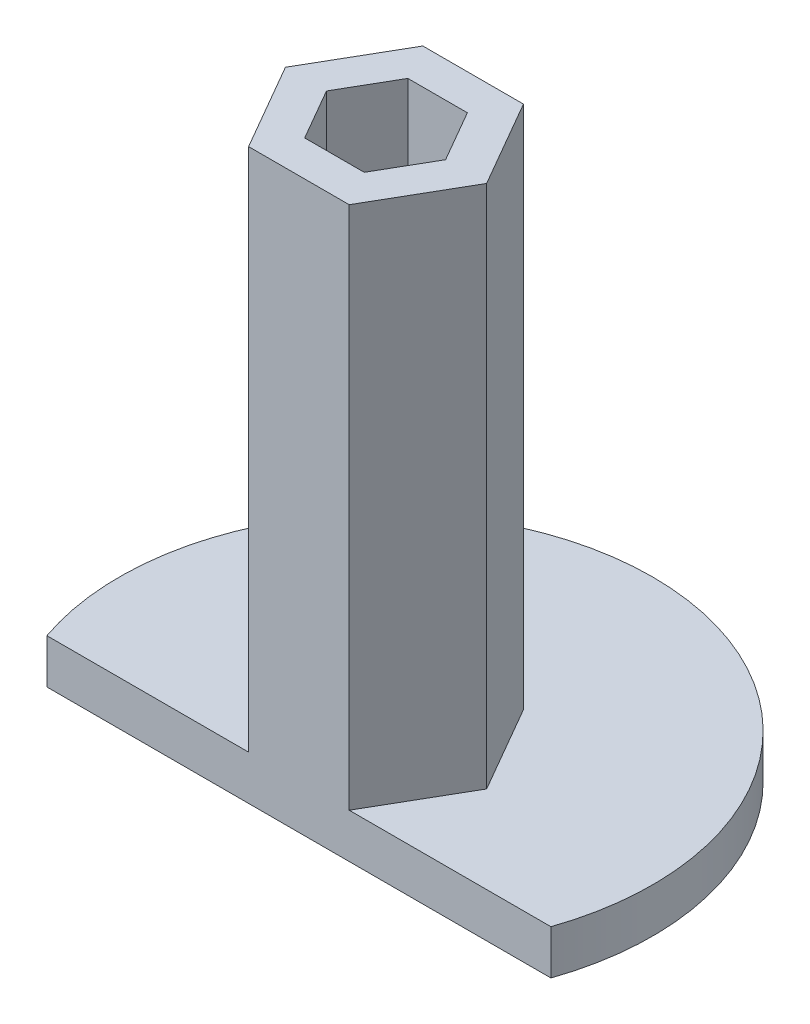
ISO-10303-21;
HEADER;
FILE_DESCRIPTION(('STEP AP214'),'2;1');
FILE_NAME('part.step','',(''),(''),'','','');
FILE_SCHEMA(('AUTOMOTIVE_DESIGN { 1 0 10303 214 1 1 1 1 }'));
ENDSEC;
DATA;
#1=APPLICATION_CONTEXT('core data for automotive mechanical design processes');
#2=APPLICATION_PROTOCOL_DEFINITION('international standard','automotive_design',2000,#1);
#3=PRODUCT_CONTEXT('',#1,'mechanical');
#4=PRODUCT('Part','Part','',(#3));
#5=PRODUCT_RELATED_PRODUCT_CATEGORY('part','',(#4));
#6=PRODUCT_DEFINITION_FORMATION('','',#4);
#7=PRODUCT_DEFINITION_CONTEXT('part definition',#1,'design');
#8=PRODUCT_DEFINITION('design','',#6,#7);
#9=PRODUCT_DEFINITION_SHAPE('','',#8);
#10=(LENGTH_UNIT() NAMED_UNIT(*) SI_UNIT(.MILLI.,.METRE.));
#11=(NAMED_UNIT(*) PLANE_ANGLE_UNIT() SI_UNIT($,.RADIAN.));
#12=(NAMED_UNIT(*) SI_UNIT($,.STERADIAN.) SOLID_ANGLE_UNIT());
#13=UNCERTAINTY_MEASURE_WITH_UNIT(LENGTH_MEASURE(1.E-05),#10,'distance_accuracy_value','');
#14=(GEOMETRIC_REPRESENTATION_CONTEXT(3) GLOBAL_UNCERTAINTY_ASSIGNED_CONTEXT((#13)) GLOBAL_UNIT_ASSIGNED_CONTEXT((#10,
#11,#12)) REPRESENTATION_CONTEXT('',''));
#15=CARTESIAN_POINT('',(0.,0.,0.));
#16=DIRECTION('',(0.,0.,1.));
#17=DIRECTION('',(1.,0.,0.));
#18=AXIS2_PLACEMENT_3D('',#15,#16,#17);
#19=CARTESIAN_POINT('',(0.,12.,0.));
#20=DIRECTION('',(0.,1.,0.));
#21=DIRECTION('',(0.,0.,1.));
#22=AXIS2_PLACEMENT_3D('',#19,#20,#21);
#23=PLANE('',#22);
#24=DIRECTION('',(-1.,0.,0.));
#25=VECTOR('',#24,1.);
#26=CARTESIAN_POINT('',(2.82970053837925,12.,-4.90118510267787));
#27=LINE('',#26,#25);
#28=CARTESIAN_POINT('',(2.82970053837925,12.,-4.90118510267787));
#29=VERTEX_POINT('',#28);
#30=CARTESIAN_POINT('',(-2.82970053837925,12.,-4.90118510267787));
#31=VERTEX_POINT('',#30);
#32=EDGE_CURVE('E215',#29,#31,#27,.T.);
#33=ORIENTED_EDGE('',*,*,#32,.T.);
#34=DIRECTION('',(-0.5,0.,0.866025403784439));
#35=VECTOR('',#34,1.);
#36=CARTESIAN_POINT('',(-2.82970053837925,12.,-4.90118510267787));
#37=LINE('',#36,#35);
#38=CARTESIAN_POINT('',(-5.6594010767585,12.,0.));
#39=VERTEX_POINT('',#38);
#40=EDGE_CURVE('E217',#31,#39,#37,.T.);
#41=ORIENTED_EDGE('',*,*,#40,.T.);
#42=DIRECTION('',(0.5,0.,0.866025403784439));
#43=VECTOR('',#42,1.);
#44=CARTESIAN_POINT('',(-5.6594010767585,12.,0.));
#45=LINE('',#44,#43);
#46=CARTESIAN_POINT('',(-2.82970053837925,12.,4.90118510267787));
#47=VERTEX_POINT('',#46);
#48=EDGE_CURVE('E219',#39,#47,#45,.T.);
#49=ORIENTED_EDGE('',*,*,#48,.T.);
#50=DIRECTION('',(1.,0.,0.));
#51=VECTOR('',#50,1.);
#52=CARTESIAN_POINT('',(-2.82970053837925,12.,4.90118510267787));
#53=LINE('',#52,#51);
#54=CARTESIAN_POINT('',(2.82970053837925,12.,4.90118510267787));
#55=VERTEX_POINT('',#54);
#56=EDGE_CURVE('E221',#47,#55,#53,.T.);
#57=ORIENTED_EDGE('',*,*,#56,.T.);
#58=DIRECTION('',(0.5,0.,-0.866025403784439));
#59=VECTOR('',#58,1.);
#60=CARTESIAN_POINT('',(2.82970053837925,12.,4.90118510267787));
#61=LINE('',#60,#59);
#62=CARTESIAN_POINT('',(5.6594010767585,12.,0.));
#63=VERTEX_POINT('',#62);
#64=EDGE_CURVE('E223',#55,#63,#61,.T.);
#65=ORIENTED_EDGE('',*,*,#64,.T.);
#66=DIRECTION('',(-0.5,0.,-0.866025403784438));
#67=VECTOR('',#66,1.);
#68=CARTESIAN_POINT('',(5.6594010767585,12.,0.));
#69=LINE('',#68,#67);
#70=EDGE_CURVE('E56',#63,#29,#69,.T.);
#71=ORIENTED_EDGE('',*,*,#70,.T.);
#72=EDGE_LOOP('',(#33,#41,#49,#57,#65,#71));
#73=FACE_BOUND('',#72,.T.);
#74=DIRECTION('',(-0.499999999999999,0.,0.866025403784439));
#75=VECTOR('',#74,1.);
#76=CARTESIAN_POINT('',(-1.675,12.,-2.90118510267787));
#77=LINE('',#76,#75);
#78=CARTESIAN_POINT('',(-1.675,12.,-2.90118510267787));
#79=VERTEX_POINT('',#78);
#80=CARTESIAN_POINT('',(-3.35,12.,0.));
#81=VERTEX_POINT('',#80);
#82=EDGE_CURVE('E176',#79,#81,#77,.T.);
#83=ORIENTED_EDGE('',*,*,#82,.F.);
#84=DIRECTION('',(-1.,0.,0.));
#85=VECTOR('',#84,1.);
#86=CARTESIAN_POINT('',(1.675,12.,-2.90118510267787));
#87=LINE('',#86,#85);
#88=CARTESIAN_POINT('',(1.675,12.,-2.90118510267787));
#89=VERTEX_POINT('',#88);
#90=EDGE_CURVE('E174',#89,#79,#87,.T.);
#91=ORIENTED_EDGE('',*,*,#90,.F.);
#92=DIRECTION('',(-0.5,0.,-0.866025403784438));
#93=VECTOR('',#92,1.);
#94=CARTESIAN_POINT('',(3.35,12.,0.));
#95=LINE('',#94,#93);
#96=CARTESIAN_POINT('',(3.35,12.,0.));
#97=VERTEX_POINT('',#96);
#98=EDGE_CURVE('E185',#97,#89,#95,.T.);
#99=ORIENTED_EDGE('',*,*,#98,.F.);
#100=DIRECTION('',(0.5,0.,-0.866025403784439));
#101=VECTOR('',#100,1.);
#102=CARTESIAN_POINT('',(1.675,12.,2.90118510267787));
#103=LINE('',#102,#101);
#104=CARTESIAN_POINT('',(1.675,12.,2.90118510267787));
#105=VERTEX_POINT('',#104);
#106=EDGE_CURVE('E183',#105,#97,#103,.T.);
#107=ORIENTED_EDGE('',*,*,#106,.F.);
#108=DIRECTION('',(1.,0.,0.));
#109=VECTOR('',#108,1.);
#110=CARTESIAN_POINT('',(-1.675,12.,2.90118510267787));
#111=LINE('',#110,#109);
#112=CARTESIAN_POINT('',(-1.675,12.,2.90118510267787));
#113=VERTEX_POINT('',#112);
#114=EDGE_CURVE('E181',#113,#105,#111,.T.);
#115=ORIENTED_EDGE('',*,*,#114,.F.);
#116=DIRECTION('',(0.5,0.,0.866025403784439));
#117=VECTOR('',#116,1.);
#118=CARTESIAN_POINT('',(-3.35,12.,0.));
#119=LINE('',#118,#117);
#120=EDGE_CURVE('E179',#81,#113,#119,.T.);
#121=ORIENTED_EDGE('',*,*,#120,.F.);
#122=EDGE_LOOP('',(#83,#91,#99,#107,#115,#121));
#123=FACE_BOUND('',#122,.T.);
#124=ADVANCED_FACE('F33',(#73,#123),#23,.T.);
#125=CARTESIAN_POINT('',(2.82970053837925,12.,-4.90118510267787));
#126=DIRECTION('',(0.,0.,1.));
#127=DIRECTION('',(1.,0.,0.));
#128=AXIS2_PLACEMENT_3D('',#125,#126,#127);
#129=PLANE('',#128);
#130=DIRECTION('',(0.,-1.,0.));
#131=VECTOR('',#130,1.);
#132=CARTESIAN_POINT('',(2.82970053837925,12.,-4.90118510267787));
#133=LINE('',#132,#131);
#134=CARTESIAN_POINT('',(2.82970053837925,-17.5,-4.90118510267787));
#135=VERTEX_POINT('',#134);
#136=EDGE_CURVE('E226',#29,#135,#133,.T.);
#137=ORIENTED_EDGE('',*,*,#136,.T.);
#138=DIRECTION('',(1.,0.,0.));
#139=VECTOR('',#138,1.);
#140=CARTESIAN_POINT('',(-2.82970053837925,-17.5,-4.90118510267787));
#141=LINE('',#140,#139);
#142=CARTESIAN_POINT('',(-2.82970053837925,-17.5,-4.90118510267787));
#143=VERTEX_POINT('',#142);
#144=EDGE_CURVE('E157',#143,#135,#141,.T.);
#145=ORIENTED_EDGE('',*,*,#144,.F.);
#146=DIRECTION('',(0.,-1.,0.));
#147=VECTOR('',#146,1.);
#148=CARTESIAN_POINT('',(-2.82970053837925,12.,-4.90118510267787));
#149=LINE('',#148,#147);
#150=EDGE_CURVE('E11',#31,#143,#149,.T.);
#151=ORIENTED_EDGE('',*,*,#150,.F.);
#152=ORIENTED_EDGE('',*,*,#32,.F.);
#153=EDGE_LOOP('',(#137,#145,#151,#152));
#154=FACE_BOUND('',#153,.T.);
#155=ADVANCED_FACE('F35',(#154),#129,.F.);
#156=CARTESIAN_POINT('',(-2.82970053837925,12.,-4.90118510267787));
#157=DIRECTION('',(0.866025403784439,0.,0.5));
#158=DIRECTION('',(0.5,0.,-0.866025403784439));
#159=AXIS2_PLACEMENT_3D('',#156,#157,#158);
#160=PLANE('',#159);
#161=ORIENTED_EDGE('',*,*,#150,.T.);
#162=DIRECTION('',(0.5,0.,-0.866025403784439));
#163=VECTOR('',#162,1.);
#164=CARTESIAN_POINT('',(-5.6594010767585,-17.5,0.));
#165=LINE('',#164,#163);
#166=CARTESIAN_POINT('',(-5.6594010767585,-17.5,0.));
#167=VERTEX_POINT('',#166);
#168=EDGE_CURVE('E154',#167,#143,#165,.T.);
#169=ORIENTED_EDGE('',*,*,#168,.F.);
#170=DIRECTION('',(0.,-1.,0.));
#171=VECTOR('',#170,1.);
#172=CARTESIAN_POINT('',(-5.6594010767585,12.,0.));
#173=LINE('',#172,#171);
#174=EDGE_CURVE('E41',#39,#167,#173,.T.);
#175=ORIENTED_EDGE('',*,*,#174,.F.);
#176=ORIENTED_EDGE('',*,*,#40,.F.);
#177=EDGE_LOOP('',(#161,#169,#175,#176));
#178=FACE_BOUND('',#177,.T.);
#179=ADVANCED_FACE('F257',(#178),#160,.F.);
#180=CARTESIAN_POINT('',(-5.6594010767585,12.,0.));
#181=DIRECTION('',(0.866025403784439,0.,-0.5));
#182=DIRECTION('',(-0.5,0.,-0.866025403784439));
#183=AXIS2_PLACEMENT_3D('',#180,#181,#182);
#184=PLANE('',#183);
#185=ORIENTED_EDGE('',*,*,#174,.T.);
#186=DIRECTION('',(-0.5,0.,-0.866025403784439));
#187=VECTOR('',#186,1.);
#188=CARTESIAN_POINT('',(-2.82970053837925,-17.5,4.90118510267787));
#189=LINE('',#188,#187);
#190=CARTESIAN_POINT('',(-2.82970053837925,-17.5,4.90118510267787));
#191=VERTEX_POINT('',#190);
#192=EDGE_CURVE('E170',#191,#167,#189,.T.);
#193=ORIENTED_EDGE('',*,*,#192,.F.);
#194=DIRECTION('',(0.,-1.,0.));
#195=VECTOR('',#194,1.);
#196=CARTESIAN_POINT('',(-2.82970053837925,12.,4.90118510267787));
#197=LINE('',#196,#195);
#198=EDGE_CURVE('E232',#47,#191,#197,.T.);
#199=ORIENTED_EDGE('',*,*,#198,.F.);
#200=ORIENTED_EDGE('',*,*,#48,.F.);
#201=EDGE_LOOP('',(#185,#193,#199,#200));
#202=FACE_BOUND('',#201,.T.);
#203=ADVANCED_FACE('F238',(#202),#184,.F.);
#204=CARTESIAN_POINT('',(-2.82970053837925,12.,4.90118510267787));
#205=DIRECTION('',(0.,0.,-1.));
#206=DIRECTION('',(-1.,0.,0.));
#207=AXIS2_PLACEMENT_3D('',#204,#205,#206);
#208=PLANE('',#207);
#209=ORIENTED_EDGE('',*,*,#198,.T.);
#210=DIRECTION('',(-1.,0.,0.));
#211=VECTOR('',#210,1.);
#212=CARTESIAN_POINT('',(-14.1766845415029,-17.5,4.90118510267787));
#213=LINE('',#212,#211);
#214=CARTESIAN_POINT('',(-14.1766845415029,-17.5,4.90118510267787));
#215=VERTEX_POINT('',#214);
#216=EDGE_CURVE('E244',#191,#215,#213,.T.);
#217=ORIENTED_EDGE('',*,*,#216,.T.);
#218=DIRECTION('',(0.,1.,0.));
#219=VECTOR('',#218,1.);
#220=CARTESIAN_POINT('',(-14.1766845415029,-20.,4.90118510267787));
#221=LINE('',#220,#219);
#222=CARTESIAN_POINT('',(-14.1766845415029,-20.,4.90118510267787));
#223=VERTEX_POINT('',#222);
#224=EDGE_CURVE('E142',#223,#215,#221,.T.);
#225=ORIENTED_EDGE('',*,*,#224,.F.);
#226=DIRECTION('',(-1.,0.,0.));
#227=VECTOR('',#226,1.);
#228=CARTESIAN_POINT('',(-14.1766845415029,-20.,4.90118510267787));
#229=LINE('',#228,#227);
#230=CARTESIAN_POINT('',(14.1766845415029,-20.,4.90118510267787));
#231=VERTEX_POINT('',#230);
#232=EDGE_CURVE('E134',#231,#223,#229,.T.);
#233=ORIENTED_EDGE('',*,*,#232,.F.);
#234=DIRECTION('',(0.,1.,0.));
#235=VECTOR('',#234,1.);
#236=CARTESIAN_POINT('',(14.1766845415029,-20.,4.90118510267787));
#237=LINE('',#236,#235);
#238=CARTESIAN_POINT('',(14.1766845415029,-17.5,4.90118510267787));
#239=VERTEX_POINT('',#238);
#240=EDGE_CURVE('E139',#231,#239,#237,.T.);
#241=ORIENTED_EDGE('',*,*,#240,.T.);
#242=CARTESIAN_POINT('',(2.82970053837925,-17.5,4.90118510267787));
#243=VERTEX_POINT('',#242);
#244=EDGE_CURVE('E149',#239,#243,#213,.T.);
#245=ORIENTED_EDGE('',*,*,#244,.T.);
#246=DIRECTION('',(0.,-1.,0.));
#247=VECTOR('',#246,1.);
#248=CARTESIAN_POINT('',(2.82970053837925,12.,4.90118510267787));
#249=LINE('',#248,#247);
#250=EDGE_CURVE('E230',#55,#243,#249,.T.);
#251=ORIENTED_EDGE('',*,*,#250,.F.);
#252=ORIENTED_EDGE('',*,*,#56,.F.);
#253=EDGE_LOOP('',(#209,#217,#225,#233,#241,#245,#251,#252));
#254=FACE_BOUND('',#253,.T.);
#255=ADVANCED_FACE('F136',(#254),#208,.F.);
#256=CARTESIAN_POINT('',(2.82970053837925,12.,4.90118510267787));
#257=DIRECTION('',(-0.866025403784439,0.,-0.5));
#258=DIRECTION('',(-0.5,0.,0.866025403784439));
#259=AXIS2_PLACEMENT_3D('',#256,#257,#258);
#260=PLANE('',#259);
#261=ORIENTED_EDGE('',*,*,#250,.T.);
#262=DIRECTION('',(-0.5,0.,0.866025403784439));
#263=VECTOR('',#262,1.);
#264=CARTESIAN_POINT('',(5.6594010767585,-17.5,0.));
#265=LINE('',#264,#263);
#266=CARTESIAN_POINT('',(5.6594010767585,-17.5,0.));
#267=VERTEX_POINT('',#266);
#268=EDGE_CURVE('E167',#267,#243,#265,.T.);
#269=ORIENTED_EDGE('',*,*,#268,.F.);
#270=DIRECTION('',(0.,-1.,0.));
#271=VECTOR('',#270,1.);
#272=CARTESIAN_POINT('',(5.6594010767585,12.,0.));
#273=LINE('',#272,#271);
#274=EDGE_CURVE('E228',#63,#267,#273,.T.);
#275=ORIENTED_EDGE('',*,*,#274,.F.);
#276=ORIENTED_EDGE('',*,*,#64,.F.);
#277=EDGE_LOOP('',(#261,#269,#275,#276));
#278=FACE_BOUND('',#277,.T.);
#279=ADVANCED_FACE('F253',(#278),#260,.F.);
#280=CARTESIAN_POINT('',(5.6594010767585,12.,0.));
#281=DIRECTION('',(-0.866025403784438,0.,0.5));
#282=DIRECTION('',(0.5,0.,0.866025403784439));
#283=AXIS2_PLACEMENT_3D('',#280,#281,#282);
#284=PLANE('',#283);
#285=ORIENTED_EDGE('',*,*,#274,.T.);
#286=DIRECTION('',(0.5,0.,0.866025403784438));
#287=VECTOR('',#286,1.);
#288=CARTESIAN_POINT('',(2.82970053837925,-17.5,-4.90118510267787));
#289=LINE('',#288,#287);
#290=EDGE_CURVE('E164',#135,#267,#289,.T.);
#291=ORIENTED_EDGE('',*,*,#290,.F.);
#292=ORIENTED_EDGE('',*,*,#136,.F.);
#293=ORIENTED_EDGE('',*,*,#70,.F.);
#294=EDGE_LOOP('',(#285,#291,#292,#293));
#295=FACE_BOUND('',#294,.T.);
#296=ADVANCED_FACE('F261',(#295),#284,.F.);
#297=CARTESIAN_POINT('',(1.675,12.,-2.90118510267787));
#298=DIRECTION('',(0.,0.,1.));
#299=DIRECTION('',(1.,0.,0.));
#300=AXIS2_PLACEMENT_3D('',#297,#298,#299);
#301=PLANE('',#300);
#302=DIRECTION('',(-1.,0.,0.));
#303=VECTOR('',#302,1.);
#304=CARTESIAN_POINT('',(1.675,0.,-2.90118510267787));
#305=LINE('',#304,#303);
#306=CARTESIAN_POINT('',(1.675,0.,-2.90118510267787));
#307=VERTEX_POINT('',#306);
#308=CARTESIAN_POINT('',(-1.675,0.,-2.90118510267787));
#309=VERTEX_POINT('',#308);
#310=EDGE_CURVE('E173',#307,#309,#305,.T.);
#311=ORIENTED_EDGE('',*,*,#310,.F.);
#312=DIRECTION('',(0.,-1.,0.));
#313=VECTOR('',#312,1.);
#314=CARTESIAN_POINT('',(1.675,12.,-2.90118510267787));
#315=LINE('',#314,#313);
#316=EDGE_CURVE('E187',#89,#307,#315,.T.);
#317=ORIENTED_EDGE('',*,*,#316,.F.);
#318=ORIENTED_EDGE('',*,*,#90,.T.);
#319=DIRECTION('',(0.,-1.,0.));
#320=VECTOR('',#319,1.);
#321=CARTESIAN_POINT('',(-1.675,12.,-2.90118510267787));
#322=LINE('',#321,#320);
#323=EDGE_CURVE('E212',#79,#309,#322,.T.);
#324=ORIENTED_EDGE('',*,*,#323,.T.);
#325=EDGE_LOOP('',(#311,#317,#318,#324));
#326=FACE_BOUND('',#325,.T.);
#327=ADVANCED_FACE('F263',(#326),#301,.T.);
#328=CARTESIAN_POINT('',(-1.675,12.,-2.90118510267787));
#329=DIRECTION('',(0.866025403784439,0.,0.499999999999999));
#330=DIRECTION('',(0.499999999999999,0.,-0.866025403784439));
#331=AXIS2_PLACEMENT_3D('',#328,#329,#330);
#332=PLANE('',#331);
#333=DIRECTION('',(-0.499999999999999,0.,0.866025403784439));
#334=VECTOR('',#333,1.);
#335=CARTESIAN_POINT('',(-1.675,0.,-2.90118510267787));
#336=LINE('',#335,#334);
#337=CARTESIAN_POINT('',(-3.35,0.,0.));
#338=VERTEX_POINT('',#337);
#339=EDGE_CURVE('E190',#309,#338,#336,.T.);
#340=ORIENTED_EDGE('',*,*,#339,.F.);
#341=ORIENTED_EDGE('',*,*,#323,.F.);
#342=ORIENTED_EDGE('',*,*,#82,.T.);
#343=DIRECTION('',(0.,-1.,0.));
#344=VECTOR('',#343,1.);
#345=CARTESIAN_POINT('',(-3.35,12.,0.));
#346=LINE('',#345,#344);
#347=EDGE_CURVE('E210',#81,#338,#346,.T.);
#348=ORIENTED_EDGE('',*,*,#347,.T.);
#349=EDGE_LOOP('',(#340,#341,#342,#348));
#350=FACE_BOUND('',#349,.T.);
#351=ADVANCED_FACE('F269',(#350),#332,.T.);
#352=CARTESIAN_POINT('',(-3.35,12.,0.));
#353=DIRECTION('',(0.866025403784438,0.,-0.5));
#354=DIRECTION('',(-0.5,0.,-0.866025403784439));
#355=AXIS2_PLACEMENT_3D('',#352,#353,#354);
#356=PLANE('',#355);
#357=DIRECTION('',(0.5,0.,0.866025403784439));
#358=VECTOR('',#357,1.);
#359=CARTESIAN_POINT('',(-3.35,0.,0.));
#360=LINE('',#359,#358);
#361=CARTESIAN_POINT('',(-1.675,0.,2.90118510267787));
#362=VERTEX_POINT('',#361);
#363=EDGE_CURVE('E193',#338,#362,#360,.T.);
#364=ORIENTED_EDGE('',*,*,#363,.F.);
#365=ORIENTED_EDGE('',*,*,#347,.F.);
#366=ORIENTED_EDGE('',*,*,#120,.T.);
#367=DIRECTION('',(0.,-1.,0.));
#368=VECTOR('',#367,1.);
#369=CARTESIAN_POINT('',(-1.675,12.,2.90118510267787));
#370=LINE('',#369,#368);
#371=EDGE_CURVE('E208',#113,#362,#370,.T.);
#372=ORIENTED_EDGE('',*,*,#371,.T.);
#373=EDGE_LOOP('',(#364,#365,#366,#372));
#374=FACE_BOUND('',#373,.T.);
#375=ADVANCED_FACE('F281',(#374),#356,.T.);
#376=CARTESIAN_POINT('',(-1.675,12.,2.90118510267787));
#377=DIRECTION('',(0.,0.,-1.));
#378=DIRECTION('',(-1.,0.,0.));
#379=AXIS2_PLACEMENT_3D('',#376,#377,#378);
#380=PLANE('',#379);
#381=DIRECTION('',(1.,0.,0.));
#382=VECTOR('',#381,1.);
#383=CARTESIAN_POINT('',(-1.675,0.,2.90118510267787));
#384=LINE('',#383,#382);
#385=CARTESIAN_POINT('',(1.675,0.,2.90118510267787));
#386=VERTEX_POINT('',#385);
#387=EDGE_CURVE('E196',#362,#386,#384,.T.);
#388=ORIENTED_EDGE('',*,*,#387,.F.);
#389=ORIENTED_EDGE('',*,*,#371,.F.);
#390=ORIENTED_EDGE('',*,*,#114,.T.);
#391=DIRECTION('',(0.,-1.,0.));
#392=VECTOR('',#391,1.);
#393=CARTESIAN_POINT('',(1.675,12.,2.90118510267787));
#394=LINE('',#393,#392);
#395=EDGE_CURVE('E206',#105,#386,#394,.T.);
#396=ORIENTED_EDGE('',*,*,#395,.T.);
#397=EDGE_LOOP('',(#388,#389,#390,#396));
#398=FACE_BOUND('',#397,.T.);
#399=ADVANCED_FACE('F285',(#398),#380,.T.);
#400=CARTESIAN_POINT('',(1.675,12.,2.90118510267787));
#401=DIRECTION('',(-0.866025403784439,0.,-0.5));
#402=DIRECTION('',(-0.5,0.,0.866025403784439));
#403=AXIS2_PLACEMENT_3D('',#400,#401,#402);
#404=PLANE('',#403);
#405=DIRECTION('',(0.5,0.,-0.866025403784439));
#406=VECTOR('',#405,1.);
#407=CARTESIAN_POINT('',(1.675,0.,2.90118510267787));
#408=LINE('',#407,#406);
#409=CARTESIAN_POINT('',(3.35,0.,0.));
#410=VERTEX_POINT('',#409);
#411=EDGE_CURVE('E199',#386,#410,#408,.T.);
#412=ORIENTED_EDGE('',*,*,#411,.F.);
#413=ORIENTED_EDGE('',*,*,#395,.F.);
#414=ORIENTED_EDGE('',*,*,#106,.T.);
#415=DIRECTION('',(0.,-1.,0.));
#416=VECTOR('',#415,1.);
#417=CARTESIAN_POINT('',(3.35,12.,0.));
#418=LINE('',#417,#416);
#419=EDGE_CURVE('E48',#97,#410,#418,.T.);
#420=ORIENTED_EDGE('',*,*,#419,.T.);
#421=EDGE_LOOP('',(#412,#413,#414,#420));
#422=FACE_BOUND('',#421,.T.);
#423=ADVANCED_FACE('F289',(#422),#404,.T.);
#424=CARTESIAN_POINT('',(3.35,12.,0.));
#425=DIRECTION('',(-0.866025403784439,0.,0.5));
#426=DIRECTION('',(0.5,0.,0.866025403784439));
#427=AXIS2_PLACEMENT_3D('',#424,#425,#426);
#428=PLANE('',#427);
#429=DIRECTION('',(-0.5,0.,-0.866025403784438));
#430=VECTOR('',#429,1.);
#431=CARTESIAN_POINT('',(3.35,0.,0.));
#432=LINE('',#431,#430);
#433=EDGE_CURVE('E177',#410,#307,#432,.T.);
#434=ORIENTED_EDGE('',*,*,#433,.F.);
#435=ORIENTED_EDGE('',*,*,#419,.F.);
#436=ORIENTED_EDGE('',*,*,#98,.T.);
#437=ORIENTED_EDGE('',*,*,#316,.T.);
#438=EDGE_LOOP('',(#434,#435,#436,#437));
#439=FACE_BOUND('',#438,.T.);
#440=ADVANCED_FACE('F293',(#439),#428,.T.);
#441=CARTESIAN_POINT('',(0.,0.,0.));
#442=DIRECTION('',(0.,-1.,0.));
#443=DIRECTION('',(0.,0.,-1.));
#444=AXIS2_PLACEMENT_3D('',#441,#442,#443);
#445=PLANE('',#444);
#446=ORIENTED_EDGE('',*,*,#433,.T.);
#447=ORIENTED_EDGE('',*,*,#310,.T.);
#448=ORIENTED_EDGE('',*,*,#339,.T.);
#449=ORIENTED_EDGE('',*,*,#363,.T.);
#450=ORIENTED_EDGE('',*,*,#387,.T.);
#451=ORIENTED_EDGE('',*,*,#411,.T.);
#452=EDGE_LOOP('',(#446,#447,#448,#449,#450,#451));
#453=FACE_BOUND('',#452,.T.);
#454=ADVANCED_FACE('F297',(#453),#445,.F.);
#455=CARTESIAN_POINT('',(0.,-17.5,0.));
#456=DIRECTION('',(0.,-1.,0.));
#457=DIRECTION('',(0.,0.,-1.));
#458=AXIS2_PLACEMENT_3D('',#455,#456,#457);
#459=PLANE('',#458);
#460=ORIENTED_EDGE('',*,*,#290,.T.);
#461=ORIENTED_EDGE('',*,*,#268,.T.);
#462=ORIENTED_EDGE('',*,*,#244,.F.);
#463=CARTESIAN_POINT('',(0.,-17.5,0.));
#464=DIRECTION('',(0.,-1.,0.));
#465=DIRECTION('',(0.,0.,-1.));
#466=AXIS2_PLACEMENT_3D('',#463,#464,#465);
#467=CIRCLE('',#466,15.);
#468=EDGE_CURVE('E153',#215,#239,#467,.T.);
#469=ORIENTED_EDGE('',*,*,#468,.F.);
#470=ORIENTED_EDGE('',*,*,#216,.F.);
#471=ORIENTED_EDGE('',*,*,#192,.T.);
#472=ORIENTED_EDGE('',*,*,#168,.T.);
#473=ORIENTED_EDGE('',*,*,#144,.T.);
#474=EDGE_LOOP('',(#460,#461,#462,#469,#470,#471,#472,#473));
#475=FACE_BOUND('',#474,.T.);
#476=ADVANCED_FACE('F243',(#475),#459,.F.);
#477=CARTESIAN_POINT('',(0.,-20.,0.));
#478=DIRECTION('',(0.,1.,0.));
#479=DIRECTION('',(0.,0.,1.));
#480=AXIS2_PLACEMENT_3D('',#477,#478,#479);
#481=CYLINDRICAL_SURFACE('',#480,15.);
#482=ORIENTED_EDGE('',*,*,#468,.T.);
#483=ORIENTED_EDGE('',*,*,#240,.F.);
#484=CARTESIAN_POINT('',(0.,-20.,0.));
#485=DIRECTION('',(0.,-1.,0.));
#486=DIRECTION('',(0.,0.,-1.));
#487=AXIS2_PLACEMENT_3D('',#484,#485,#486);
#488=CIRCLE('',#487,15.);
#489=EDGE_CURVE('E145',#223,#231,#488,.T.);
#490=ORIENTED_EDGE('',*,*,#489,.F.);
#491=ORIENTED_EDGE('',*,*,#224,.T.);
#492=EDGE_LOOP('',(#482,#483,#490,#491));
#493=FACE_BOUND('',#492,.T.);
#494=ADVANCED_FACE('F151',(#493),#481,.T.);
#495=CARTESIAN_POINT('',(0.,-20.,0.));
#496=DIRECTION('',(0.,-1.,0.));
#497=DIRECTION('',(0.,0.,-1.));
#498=AXIS2_PLACEMENT_3D('',#495,#496,#497);
#499=PLANE('',#498);
#500=ORIENTED_EDGE('',*,*,#489,.T.);
#501=ORIENTED_EDGE('',*,*,#232,.T.);
#502=EDGE_LOOP('',(#500,#501));
#503=FACE_BOUND('',#502,.T.);
#504=ADVANCED_FACE('F147',(#503),#499,.T.);
#505=CLOSED_SHELL('',(#124,#155,#179,#203,#255,#279,#296,#327,#351,#375,#399,#423,#440,#454,
#476,#494,#504));
#506=MANIFOLD_SOLID_BREP('B2',#505);
#507=ADVANCED_BREP_SHAPE_REPRESENTATION('',(#18,#506),#14);
#508=SHAPE_DEFINITION_REPRESENTATION(#9,#507);
ENDSEC;
END-ISO-10303-21;
